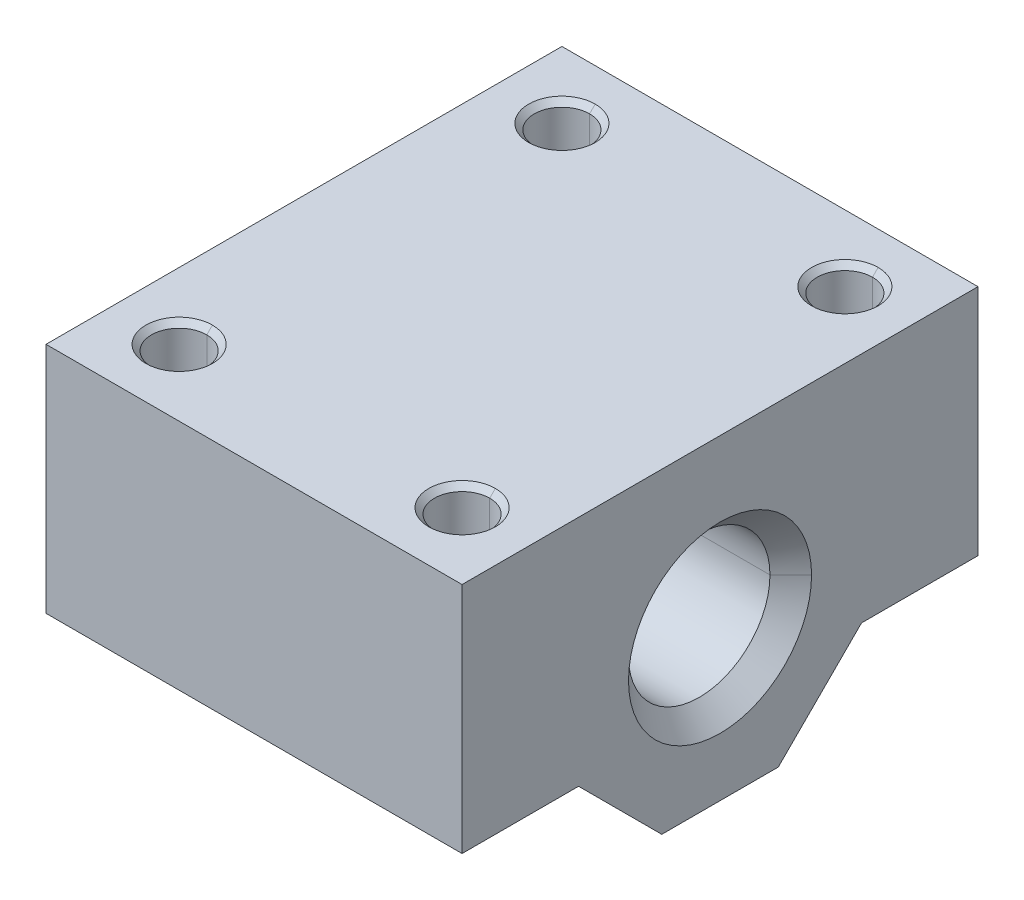
ISO-10303-21;
HEADER;
FILE_DESCRIPTION(('STEP AP214'),'2;1');
FILE_NAME('part.step','',(''),(''),'','','');
FILE_SCHEMA(('AUTOMOTIVE_DESIGN { 1 0 10303 214 1 1 1 1 }'));
ENDSEC;
DATA;
#1=APPLICATION_CONTEXT('core data for automotive mechanical design processes');
#2=APPLICATION_PROTOCOL_DEFINITION('international standard','automotive_design',2000,#1);
#3=PRODUCT_CONTEXT('',#1,'mechanical');
#4=PRODUCT('Part','Part','',(#3));
#5=PRODUCT_RELATED_PRODUCT_CATEGORY('part','',(#4));
#6=PRODUCT_DEFINITION_FORMATION('','',#4);
#7=PRODUCT_DEFINITION_CONTEXT('part definition',#1,'design');
#8=PRODUCT_DEFINITION('design','',#6,#7);
#9=PRODUCT_DEFINITION_SHAPE('','',#8);
#10=(LENGTH_UNIT() NAMED_UNIT(*) SI_UNIT(.MILLI.,.METRE.));
#11=(NAMED_UNIT(*) PLANE_ANGLE_UNIT() SI_UNIT($,.RADIAN.));
#12=(NAMED_UNIT(*) SI_UNIT($,.STERADIAN.) SOLID_ANGLE_UNIT());
#13=UNCERTAINTY_MEASURE_WITH_UNIT(LENGTH_MEASURE(1.E-05),#10,'distance_accuracy_value','');
#14=(GEOMETRIC_REPRESENTATION_CONTEXT(3) GLOBAL_UNCERTAINTY_ASSIGNED_CONTEXT((#13)) GLOBAL_UNIT_ASSIGNED_CONTEXT((#10,
#11,#12)) REPRESENTATION_CONTEXT('',''));
#15=CARTESIAN_POINT('',(0.,0.,0.));
#16=DIRECTION('',(0.,0.,1.));
#17=DIRECTION('',(1.,0.,0.));
#18=AXIS2_PLACEMENT_3D('',#15,#16,#17);
#19=CARTESIAN_POINT('',(50.,20.,31.));
#20=DIRECTION('',(0.,0.,-1.));
#21=DIRECTION('',(-1.,0.,0.));
#22=AXIS2_PLACEMENT_3D('',#19,#20,#21);
#23=PLANE('',#22);
#24=DIRECTION('',(0.,-1.,0.));
#25=VECTOR('',#24,1.);
#26=CARTESIAN_POINT('',(0.,20.,31.));
#27=LINE('',#26,#25);
#28=CARTESIAN_POINT('',(0.,20.,31.));
#29=VERTEX_POINT('',#28);
#30=CARTESIAN_POINT('',(0.,-8.,31.));
#31=VERTEX_POINT('',#30);
#32=EDGE_CURVE('E11',#29,#31,#27,.T.);
#33=ORIENTED_EDGE('',*,*,#32,.T.);
#34=DIRECTION('',(-1.,0.,0.));
#35=VECTOR('',#34,1.);
#36=CARTESIAN_POINT('',(50.,-8.,31.));
#37=LINE('',#36,#35);
#38=CARTESIAN_POINT('',(50.,-8.,31.));
#39=VERTEX_POINT('',#38);
#40=EDGE_CURVE('E25',#39,#31,#37,.T.);
#41=ORIENTED_EDGE('',*,*,#40,.F.);
#42=DIRECTION('',(0.,-1.,0.));
#43=VECTOR('',#42,1.);
#44=CARTESIAN_POINT('',(50.,20.,31.));
#45=LINE('',#44,#43);
#46=CARTESIAN_POINT('',(50.,20.,31.));
#47=VERTEX_POINT('',#46);
#48=EDGE_CURVE('E543',#47,#39,#45,.T.);
#49=ORIENTED_EDGE('',*,*,#48,.F.);
#50=DIRECTION('',(-1.,0.,0.));
#51=VECTOR('',#50,1.);
#52=CARTESIAN_POINT('',(50.,20.,31.));
#53=LINE('',#52,#51);
#54=EDGE_CURVE('E539',#47,#29,#53,.T.);
#55=ORIENTED_EDGE('',*,*,#54,.T.);
#56=EDGE_LOOP('',(#33,#41,#49,#55));
#57=FACE_BOUND('',#56,.T.);
#58=ADVANCED_FACE('F17',(#57),#23,.F.);
#59=CARTESIAN_POINT('',(50.,20.,-31.));
#60=DIRECTION('',(0.,-1.,0.));
#61=DIRECTION('',(0.,0.,-1.));
#62=AXIS2_PLACEMENT_3D('',#59,#60,#61);
#63=PLANE('',#62);
#64=CARTESIAN_POINT('',(8.,20.,-23.));
#65=DIRECTION('',(0.,-1.,0.));
#66=DIRECTION('',(0.,0.,-1.));
#67=AXIS2_PLACEMENT_3D('',#64,#65,#66);
#68=CIRCLE('',#67,4.);
#69=CARTESIAN_POINT('',(8.,20.,-27.));
#70=VERTEX_POINT('',#69);
#71=CARTESIAN_POINT('',(8.,20.,-19.));
#72=VERTEX_POINT('',#71);
#73=EDGE_CURVE('E203',#70,#72,#68,.T.);
#74=ORIENTED_EDGE('',*,*,#73,.T.);
#75=CARTESIAN_POINT('',(8.,20.,-23.));
#76=DIRECTION('',(0.,-1.,0.));
#77=DIRECTION('',(0.,0.,-1.));
#78=AXIS2_PLACEMENT_3D('',#75,#76,#77);
#79=CIRCLE('',#78,4.);
#80=EDGE_CURVE('E532',#72,#70,#79,.T.);
#81=ORIENTED_EDGE('',*,*,#80,.T.);
#82=EDGE_LOOP('',(#74,#81));
#83=FACE_BOUND('',#82,.T.);
#84=CARTESIAN_POINT('',(42.,20.,-23.));
#85=DIRECTION('',(0.,-1.,0.));
#86=DIRECTION('',(0.,0.,-1.));
#87=AXIS2_PLACEMENT_3D('',#84,#85,#86);
#88=CIRCLE('',#87,4.);
#89=CARTESIAN_POINT('',(42.,20.,-27.));
#90=VERTEX_POINT('',#89);
#91=CARTESIAN_POINT('',(42.,20.,-19.));
#92=VERTEX_POINT('',#91);
#93=EDGE_CURVE('E528',#90,#92,#88,.T.);
#94=ORIENTED_EDGE('',*,*,#93,.T.);
#95=CARTESIAN_POINT('',(42.,20.,-23.));
#96=DIRECTION('',(0.,-1.,0.));
#97=DIRECTION('',(0.,0.,-1.));
#98=AXIS2_PLACEMENT_3D('',#95,#96,#97);
#99=CIRCLE('',#98,4.);
#100=EDGE_CURVE('E524',#92,#90,#99,.T.);
#101=ORIENTED_EDGE('',*,*,#100,.T.);
#102=EDGE_LOOP('',(#94,#101));
#103=FACE_BOUND('',#102,.T.);
#104=CARTESIAN_POINT('',(42.,20.,23.));
#105=DIRECTION('',(0.,-1.,0.));
#106=DIRECTION('',(0.,0.,-1.));
#107=AXIS2_PLACEMENT_3D('',#104,#105,#106);
#108=CIRCLE('',#107,4.);
#109=CARTESIAN_POINT('',(42.,20.,19.));
#110=VERTEX_POINT('',#109);
#111=CARTESIAN_POINT('',(42.,20.,27.));
#112=VERTEX_POINT('',#111);
#113=EDGE_CURVE('E520',#110,#112,#108,.T.);
#114=ORIENTED_EDGE('',*,*,#113,.T.);
#115=CARTESIAN_POINT('',(42.,20.,23.));
#116=DIRECTION('',(0.,-1.,0.));
#117=DIRECTION('',(0.,0.,-1.));
#118=AXIS2_PLACEMENT_3D('',#115,#116,#117);
#119=CIRCLE('',#118,4.);
#120=EDGE_CURVE('E516',#112,#110,#119,.T.);
#121=ORIENTED_EDGE('',*,*,#120,.T.);
#122=EDGE_LOOP('',(#114,#121));
#123=FACE_BOUND('',#122,.T.);
#124=CARTESIAN_POINT('',(8.,20.,23.));
#125=DIRECTION('',(0.,-1.,0.));
#126=DIRECTION('',(0.,0.,-1.));
#127=AXIS2_PLACEMENT_3D('',#124,#125,#126);
#128=CIRCLE('',#127,4.);
#129=CARTESIAN_POINT('',(8.,20.,19.));
#130=VERTEX_POINT('',#129);
#131=CARTESIAN_POINT('',(8.,20.,27.));
#132=VERTEX_POINT('',#131);
#133=EDGE_CURVE('E512',#130,#132,#128,.T.);
#134=ORIENTED_EDGE('',*,*,#133,.T.);
#135=CARTESIAN_POINT('',(8.,20.,23.));
#136=DIRECTION('',(0.,-1.,0.));
#137=DIRECTION('',(0.,0.,-1.));
#138=AXIS2_PLACEMENT_3D('',#135,#136,#137);
#139=CIRCLE('',#138,4.);
#140=EDGE_CURVE('E508',#132,#130,#139,.T.);
#141=ORIENTED_EDGE('',*,*,#140,.T.);
#142=EDGE_LOOP('',(#134,#141));
#143=FACE_BOUND('',#142,.T.);
#144=DIRECTION('',(0.,0.,1.));
#145=VECTOR('',#144,1.);
#146=CARTESIAN_POINT('',(0.,20.,-31.));
#147=LINE('',#146,#145);
#148=CARTESIAN_POINT('',(0.,20.,-31.));
#149=VERTEX_POINT('',#148);
#150=EDGE_CURVE('E503',#149,#29,#147,.T.);
#151=ORIENTED_EDGE('',*,*,#150,.T.);
#152=ORIENTED_EDGE('',*,*,#54,.F.);
#153=DIRECTION('',(0.,0.,1.));
#154=VECTOR('',#153,1.);
#155=CARTESIAN_POINT('',(50.,20.,-31.));
#156=LINE('',#155,#154);
#157=CARTESIAN_POINT('',(50.,20.,-31.));
#158=VERTEX_POINT('',#157);
#159=EDGE_CURVE('E498',#158,#47,#156,.T.);
#160=ORIENTED_EDGE('',*,*,#159,.F.);
#161=DIRECTION('',(-1.,0.,0.));
#162=VECTOR('',#161,1.);
#163=CARTESIAN_POINT('',(50.,20.,-31.));
#164=LINE('',#163,#162);
#165=EDGE_CURVE('E494',#158,#149,#164,.T.);
#166=ORIENTED_EDGE('',*,*,#165,.T.);
#167=EDGE_LOOP('',(#151,#152,#160,#166));
#168=FACE_BOUND('',#167,.T.);
#169=ADVANCED_FACE('F561',(#83,#103,#123,#143,#168),#63,.F.);
#170=CARTESIAN_POINT('',(50.,-8.,-31.));
#171=DIRECTION('',(0.,0.,1.));
#172=DIRECTION('',(1.,0.,0.));
#173=AXIS2_PLACEMENT_3D('',#170,#171,#172);
#174=PLANE('',#173);
#175=DIRECTION('',(0.,1.,0.));
#176=VECTOR('',#175,1.);
#177=CARTESIAN_POINT('',(0.,-8.,-31.));
#178=LINE('',#177,#176);
#179=CARTESIAN_POINT('',(0.,-8.,-31.));
#180=VERTEX_POINT('',#179);
#181=EDGE_CURVE('E489',#180,#149,#178,.T.);
#182=ORIENTED_EDGE('',*,*,#181,.T.);
#183=ORIENTED_EDGE('',*,*,#165,.F.);
#184=DIRECTION('',(0.,1.,0.));
#185=VECTOR('',#184,1.);
#186=CARTESIAN_POINT('',(50.,-8.,-31.));
#187=LINE('',#186,#185);
#188=CARTESIAN_POINT('',(50.,-8.,-31.));
#189=VERTEX_POINT('',#188);
#190=EDGE_CURVE('E484',#189,#158,#187,.T.);
#191=ORIENTED_EDGE('',*,*,#190,.F.);
#192=DIRECTION('',(-1.,0.,0.));
#193=VECTOR('',#192,1.);
#194=CARTESIAN_POINT('',(50.,-8.,-31.));
#195=LINE('',#194,#193);
#196=EDGE_CURVE('E480',#189,#180,#195,.T.);
#197=ORIENTED_EDGE('',*,*,#196,.T.);
#198=EDGE_LOOP('',(#182,#183,#191,#197));
#199=FACE_BOUND('',#198,.T.);
#200=ADVANCED_FACE('F582',(#199),#174,.F.);
#201=CARTESIAN_POINT('',(50.,-8.,-17.));
#202=DIRECTION('',(0.,1.,0.));
#203=DIRECTION('',(0.,0.,1.));
#204=AXIS2_PLACEMENT_3D('',#201,#202,#203);
#205=PLANE('',#204);
#206=CARTESIAN_POINT('',(8.,-8.,-23.));
#207=DIRECTION('',(0.,-1.,0.));
#208=DIRECTION('',(0.,0.,-1.));
#209=AXIS2_PLACEMENT_3D('',#206,#207,#208);
#210=CIRCLE('',#209,3.3235);
#211=CARTESIAN_POINT('',(8.,-8.,-19.6765));
#212=VERTEX_POINT('',#211);
#213=CARTESIAN_POINT('',(8.,-8.,-26.3235));
#214=VERTEX_POINT('',#213);
#215=EDGE_CURVE('E192',#212,#214,#210,.T.);
#216=ORIENTED_EDGE('',*,*,#215,.F.);
#217=CARTESIAN_POINT('',(8.,-8.,-23.));
#218=DIRECTION('',(0.,-1.,0.));
#219=DIRECTION('',(0.,0.,-1.));
#220=AXIS2_PLACEMENT_3D('',#217,#218,#219);
#221=CIRCLE('',#220,3.3235);
#222=EDGE_CURVE('E473',#214,#212,#221,.T.);
#223=ORIENTED_EDGE('',*,*,#222,.F.);
#224=EDGE_LOOP('',(#216,#223));
#225=FACE_BOUND('',#224,.T.);
#226=CARTESIAN_POINT('',(42.,-8.,-23.));
#227=DIRECTION('',(0.,-1.,0.));
#228=DIRECTION('',(0.,0.,-1.));
#229=AXIS2_PLACEMENT_3D('',#226,#227,#228);
#230=CIRCLE('',#229,3.3235);
#231=CARTESIAN_POINT('',(42.,-8.,-19.6765));
#232=VERTEX_POINT('',#231);
#233=CARTESIAN_POINT('',(42.,-8.,-26.3235));
#234=VERTEX_POINT('',#233);
#235=EDGE_CURVE('E468',#232,#234,#230,.T.);
#236=ORIENTED_EDGE('',*,*,#235,.F.);
#237=CARTESIAN_POINT('',(42.,-8.,-23.));
#238=DIRECTION('',(0.,-1.,0.));
#239=DIRECTION('',(0.,0.,-1.));
#240=AXIS2_PLACEMENT_3D('',#237,#238,#239);
#241=CIRCLE('',#240,3.3235);
#242=EDGE_CURVE('E463',#234,#232,#241,.T.);
#243=ORIENTED_EDGE('',*,*,#242,.F.);
#244=EDGE_LOOP('',(#236,#243));
#245=FACE_BOUND('',#244,.T.);
#246=DIRECTION('',(0.,0.,-1.));
#247=VECTOR('',#246,1.);
#248=CARTESIAN_POINT('',(0.,-8.,-17.));
#249=LINE('',#248,#247);
#250=CARTESIAN_POINT('',(0.,-8.,-17.));
#251=VERTEX_POINT('',#250);
#252=EDGE_CURVE('E458',#251,#180,#249,.T.);
#253=ORIENTED_EDGE('',*,*,#252,.T.);
#254=ORIENTED_EDGE('',*,*,#196,.F.);
#255=DIRECTION('',(0.,0.,-1.));
#256=VECTOR('',#255,1.);
#257=CARTESIAN_POINT('',(50.,-8.,-17.));
#258=LINE('',#257,#256);
#259=CARTESIAN_POINT('',(50.,-8.,-17.));
#260=VERTEX_POINT('',#259);
#261=EDGE_CURVE('E453',#260,#189,#258,.T.);
#262=ORIENTED_EDGE('',*,*,#261,.F.);
#263=DIRECTION('',(-1.,0.,0.));
#264=VECTOR('',#263,1.);
#265=CARTESIAN_POINT('',(50.,-8.,-17.));
#266=LINE('',#265,#264);
#267=EDGE_CURVE('E449',#260,#251,#266,.T.);
#268=ORIENTED_EDGE('',*,*,#267,.T.);
#269=EDGE_LOOP('',(#253,#254,#262,#268));
#270=FACE_BOUND('',#269,.T.);
#271=ADVANCED_FACE('F579',(#225,#245,#270),#205,.F.);
#272=CARTESIAN_POINT('',(50.,-18.,-7.));
#273=DIRECTION('',(0.,0.707106781186548,0.707106781186548));
#274=DIRECTION('',(0.,-0.707106781186548,0.707106781186548));
#275=AXIS2_PLACEMENT_3D('',#272,#273,#274);
#276=PLANE('',#275);
#277=DIRECTION('',(0.,0.707106781186548,-0.707106781186548));
#278=VECTOR('',#277,1.);
#279=CARTESIAN_POINT('',(0.,-18.,-7.));
#280=LINE('',#279,#278);
#281=CARTESIAN_POINT('',(0.,-18.,-7.));
#282=VERTEX_POINT('',#281);
#283=EDGE_CURVE('E444',#282,#251,#280,.T.);
#284=ORIENTED_EDGE('',*,*,#283,.T.);
#285=ORIENTED_EDGE('',*,*,#267,.F.);
#286=DIRECTION('',(0.,0.707106781186548,-0.707106781186548));
#287=VECTOR('',#286,1.);
#288=CARTESIAN_POINT('',(50.,-18.,-7.));
#289=LINE('',#288,#287);
#290=CARTESIAN_POINT('',(50.,-18.,-7.));
#291=VERTEX_POINT('',#290);
#292=EDGE_CURVE('E439',#291,#260,#289,.T.);
#293=ORIENTED_EDGE('',*,*,#292,.F.);
#294=DIRECTION('',(-1.,0.,0.));
#295=VECTOR('',#294,1.);
#296=CARTESIAN_POINT('',(50.,-18.,-7.));
#297=LINE('',#296,#295);
#298=EDGE_CURVE('E435',#291,#282,#297,.T.);
#299=ORIENTED_EDGE('',*,*,#298,.T.);
#300=EDGE_LOOP('',(#284,#285,#293,#299));
#301=FACE_BOUND('',#300,.T.);
#302=ADVANCED_FACE('F576',(#301),#276,.F.);
#303=CARTESIAN_POINT('',(50.,-18.,7.));
#304=DIRECTION('',(0.,1.,0.));
#305=DIRECTION('',(0.,0.,1.));
#306=AXIS2_PLACEMENT_3D('',#303,#304,#305);
#307=PLANE('',#306);
#308=DIRECTION('',(0.,0.,-1.));
#309=VECTOR('',#308,1.);
#310=CARTESIAN_POINT('',(0.,-18.,7.));
#311=LINE('',#310,#309);
#312=CARTESIAN_POINT('',(0.,-18.,7.));
#313=VERTEX_POINT('',#312);
#314=EDGE_CURVE('E430',#313,#282,#311,.T.);
#315=ORIENTED_EDGE('',*,*,#314,.T.);
#316=ORIENTED_EDGE('',*,*,#298,.F.);
#317=DIRECTION('',(0.,0.,-1.));
#318=VECTOR('',#317,1.);
#319=CARTESIAN_POINT('',(50.,-18.,7.));
#320=LINE('',#319,#318);
#321=CARTESIAN_POINT('',(50.,-18.,7.));
#322=VERTEX_POINT('',#321);
#323=EDGE_CURVE('E425',#322,#291,#320,.T.);
#324=ORIENTED_EDGE('',*,*,#323,.F.);
#325=DIRECTION('',(-1.,0.,0.));
#326=VECTOR('',#325,1.);
#327=CARTESIAN_POINT('',(50.,-18.,7.));
#328=LINE('',#327,#326);
#329=EDGE_CURVE('E421',#322,#313,#328,.T.);
#330=ORIENTED_EDGE('',*,*,#329,.T.);
#331=EDGE_LOOP('',(#315,#316,#324,#330));
#332=FACE_BOUND('',#331,.T.);
#333=ADVANCED_FACE('F574',(#332),#307,.F.);
#334=CARTESIAN_POINT('',(50.,-8.,17.));
#335=DIRECTION('',(0.,0.707106781186548,-0.707106781186548));
#336=DIRECTION('',(0.,0.707106781186548,0.707106781186548));
#337=AXIS2_PLACEMENT_3D('',#334,#335,#336);
#338=PLANE('',#337);
#339=DIRECTION('',(0.,-0.707106781186548,-0.707106781186548));
#340=VECTOR('',#339,1.);
#341=CARTESIAN_POINT('',(0.,-8.,17.));
#342=LINE('',#341,#340);
#343=CARTESIAN_POINT('',(0.,-8.,17.));
#344=VERTEX_POINT('',#343);
#345=EDGE_CURVE('E416',#344,#313,#342,.T.);
#346=ORIENTED_EDGE('',*,*,#345,.T.);
#347=ORIENTED_EDGE('',*,*,#329,.F.);
#348=DIRECTION('',(0.,-0.707106781186548,-0.707106781186548));
#349=VECTOR('',#348,1.);
#350=CARTESIAN_POINT('',(50.,-8.,17.));
#351=LINE('',#350,#349);
#352=CARTESIAN_POINT('',(50.,-8.,17.));
#353=VERTEX_POINT('',#352);
#354=EDGE_CURVE('E411',#353,#322,#351,.T.);
#355=ORIENTED_EDGE('',*,*,#354,.F.);
#356=DIRECTION('',(-1.,0.,0.));
#357=VECTOR('',#356,1.);
#358=CARTESIAN_POINT('',(50.,-8.,17.));
#359=LINE('',#358,#357);
#360=EDGE_CURVE('E407',#353,#344,#359,.T.);
#361=ORIENTED_EDGE('',*,*,#360,.T.);
#362=EDGE_LOOP('',(#346,#347,#355,#361));
#363=FACE_BOUND('',#362,.T.);
#364=ADVANCED_FACE('F570',(#363),#338,.F.);
#365=CARTESIAN_POINT('',(50.,-8.,31.));
#366=DIRECTION('',(0.,1.,0.));
#367=DIRECTION('',(0.,0.,1.));
#368=AXIS2_PLACEMENT_3D('',#365,#366,#367);
#369=PLANE('',#368);
#370=CARTESIAN_POINT('',(42.,-8.,23.));
#371=DIRECTION('',(0.,-1.,0.));
#372=DIRECTION('',(0.,0.,-1.));
#373=AXIS2_PLACEMENT_3D('',#370,#371,#372);
#374=CIRCLE('',#373,3.3235);
#375=CARTESIAN_POINT('',(42.,-8.,26.3235));
#376=VERTEX_POINT('',#375);
#377=CARTESIAN_POINT('',(42.,-8.,19.6765));
#378=VERTEX_POINT('',#377);
#379=EDGE_CURVE('E402',#376,#378,#374,.T.);
#380=ORIENTED_EDGE('',*,*,#379,.F.);
#381=CARTESIAN_POINT('',(42.,-8.,23.));
#382=DIRECTION('',(0.,-1.,0.));
#383=DIRECTION('',(0.,0.,-1.));
#384=AXIS2_PLACEMENT_3D('',#381,#382,#383);
#385=CIRCLE('',#384,3.3235);
#386=EDGE_CURVE('E397',#378,#376,#385,.T.);
#387=ORIENTED_EDGE('',*,*,#386,.F.);
#388=EDGE_LOOP('',(#380,#387));
#389=FACE_BOUND('',#388,.T.);
#390=CARTESIAN_POINT('',(8.,-8.,23.));
#391=DIRECTION('',(0.,-1.,0.));
#392=DIRECTION('',(0.,0.,-1.));
#393=AXIS2_PLACEMENT_3D('',#390,#391,#392);
#394=CIRCLE('',#393,3.3235);
#395=CARTESIAN_POINT('',(8.,-8.,26.3235));
#396=VERTEX_POINT('',#395);
#397=CARTESIAN_POINT('',(8.,-8.,19.6765));
#398=VERTEX_POINT('',#397);
#399=EDGE_CURVE('E392',#396,#398,#394,.T.);
#400=ORIENTED_EDGE('',*,*,#399,.F.);
#401=CARTESIAN_POINT('',(8.,-8.,23.));
#402=DIRECTION('',(0.,-1.,0.));
#403=DIRECTION('',(0.,0.,-1.));
#404=AXIS2_PLACEMENT_3D('',#401,#402,#403);
#405=CIRCLE('',#404,3.3235);
#406=EDGE_CURVE('E387',#398,#396,#405,.T.);
#407=ORIENTED_EDGE('',*,*,#406,.F.);
#408=EDGE_LOOP('',(#400,#407));
#409=FACE_BOUND('',#408,.T.);
#410=DIRECTION('',(0.,0.,-1.));
#411=VECTOR('',#410,1.);
#412=CARTESIAN_POINT('',(0.,-8.,31.));
#413=LINE('',#412,#411);
#414=EDGE_CURVE('E382',#31,#344,#413,.T.);
#415=ORIENTED_EDGE('',*,*,#414,.T.);
#416=ORIENTED_EDGE('',*,*,#360,.F.);
#417=DIRECTION('',(0.,0.,-1.));
#418=VECTOR('',#417,1.);
#419=CARTESIAN_POINT('',(50.,-8.,31.));
#420=LINE('',#419,#418);
#421=EDGE_CURVE('E377',#39,#353,#420,.T.);
#422=ORIENTED_EDGE('',*,*,#421,.F.);
#423=ORIENTED_EDGE('',*,*,#40,.T.);
#424=EDGE_LOOP('',(#415,#416,#422,#423));
#425=FACE_BOUND('',#424,.T.);
#426=ADVANCED_FACE('F553',(#389,#409,#425),#369,.F.);
#427=CARTESIAN_POINT('',(50.,0.,0.));
#428=DIRECTION('',(1.,0.,0.));
#429=DIRECTION('',(0.,0.,-1.));
#430=AXIS2_PLACEMENT_3D('',#427,#428,#429);
#431=PLANE('',#430);
#432=CARTESIAN_POINT('',(50.,0.,0.));
#433=DIRECTION('',(1.,0.,0.));
#434=DIRECTION('',(0.,0.,-1.));
#435=AXIS2_PLACEMENT_3D('',#432,#433,#434);
#436=CIRCLE('',#435,11.);
#437=CARTESIAN_POINT('',(50.,0.,11.));
#438=VERTEX_POINT('',#437);
#439=CARTESIAN_POINT('',(50.,0.,-11.));
#440=VERTEX_POINT('',#439);
#441=EDGE_CURVE('E372',#438,#440,#436,.T.);
#442=ORIENTED_EDGE('',*,*,#441,.F.);
#443=CARTESIAN_POINT('',(50.,0.,0.));
#444=DIRECTION('',(1.,0.,0.));
#445=DIRECTION('',(0.,0.,-1.));
#446=AXIS2_PLACEMENT_3D('',#443,#444,#445);
#447=CIRCLE('',#446,11.);
#448=EDGE_CURVE('E367',#440,#438,#447,.T.);
#449=ORIENTED_EDGE('',*,*,#448,.F.);
#450=EDGE_LOOP('',(#442,#449));
#451=FACE_BOUND('',#450,.T.);
#452=ORIENTED_EDGE('',*,*,#48,.T.);
#453=ORIENTED_EDGE('',*,*,#421,.T.);
#454=ORIENTED_EDGE('',*,*,#354,.T.);
#455=ORIENTED_EDGE('',*,*,#323,.T.);
#456=ORIENTED_EDGE('',*,*,#292,.T.);
#457=ORIENTED_EDGE('',*,*,#261,.T.);
#458=ORIENTED_EDGE('',*,*,#190,.T.);
#459=ORIENTED_EDGE('',*,*,#159,.T.);
#460=EDGE_LOOP('',(#452,#453,#454,#455,#456,#457,#458,#459));
#461=FACE_BOUND('',#460,.T.);
#462=ADVANCED_FACE('F557',(#451,#461),#431,.T.);
#463=CARTESIAN_POINT('',(47.5,0.,0.));
#464=DIRECTION('',(1.,0.,0.));
#465=DIRECTION('',(0.,-1.,0.));
#466=AXIS2_PLACEMENT_3D('',#463,#464,#465);
#467=CONICAL_SURFACE('',#466,8.5,0.785398163397446);
#468=DIRECTION('',(0.707106781186549,0.,0.707106781186546));
#469=VECTOR('',#468,1.);
#470=CARTESIAN_POINT('',(47.5,0.,8.5));
#471=LINE('',#470,#469);
#472=CARTESIAN_POINT('',(47.5,0.,8.5));
#473=VERTEX_POINT('',#472);
#474=EDGE_CURVE('E362',#473,#438,#471,.T.);
#475=ORIENTED_EDGE('',*,*,#474,.F.);
#476=CARTESIAN_POINT('',(47.5,0.,0.));
#477=DIRECTION('',(1.,0.,0.));
#478=DIRECTION('',(0.,0.,-1.));
#479=AXIS2_PLACEMENT_3D('',#476,#477,#478);
#480=CIRCLE('',#479,8.5);
#481=CARTESIAN_POINT('',(47.5,0.,-8.5));
#482=VERTEX_POINT('',#481);
#483=EDGE_CURVE('E357',#482,#473,#480,.T.);
#484=ORIENTED_EDGE('',*,*,#483,.F.);
#485=DIRECTION('',(0.707106781186549,0.,-0.707106781186546));
#486=VECTOR('',#485,1.);
#487=CARTESIAN_POINT('',(47.5,0.,-8.5));
#488=LINE('',#487,#486);
#489=EDGE_CURVE('E352',#482,#440,#488,.T.);
#490=ORIENTED_EDGE('',*,*,#489,.T.);
#491=ORIENTED_EDGE('',*,*,#448,.T.);
#492=EDGE_LOOP('',(#475,#484,#490,#491));
#493=FACE_BOUND('',#492,.T.);
#494=ADVANCED_FACE('F664',(#493),#467,.F.);
#495=CARTESIAN_POINT('',(47.5,0.,0.));
#496=DIRECTION('',(1.,0.,0.));
#497=DIRECTION('',(0.,1.,0.));
#498=AXIS2_PLACEMENT_3D('',#495,#496,#497);
#499=CONICAL_SURFACE('',#498,8.5,0.785398163397446);
#500=ORIENTED_EDGE('',*,*,#474,.T.);
#501=ORIENTED_EDGE('',*,*,#441,.T.);
#502=ORIENTED_EDGE('',*,*,#489,.F.);
#503=CARTESIAN_POINT('',(47.5,0.,0.));
#504=DIRECTION('',(1.,0.,0.));
#505=DIRECTION('',(0.,0.,-1.));
#506=AXIS2_PLACEMENT_3D('',#503,#504,#505);
#507=CIRCLE('',#506,8.5);
#508=EDGE_CURVE('E347',#473,#482,#507,.T.);
#509=ORIENTED_EDGE('',*,*,#508,.F.);
#510=EDGE_LOOP('',(#500,#501,#502,#509));
#511=FACE_BOUND('',#510,.T.);
#512=ADVANCED_FACE('F675',(#511),#499,.F.);
#513=CARTESIAN_POINT('',(50.,0.,0.));
#514=DIRECTION('',(1.,0.,0.));
#515=DIRECTION('',(0.,1.,0.));
#516=AXIS2_PLACEMENT_3D('',#513,#514,#515);
#517=CYLINDRICAL_SURFACE('',#516,8.5);
#518=DIRECTION('',(1.,0.,0.));
#519=VECTOR('',#518,1.);
#520=CARTESIAN_POINT('',(2.5,0.,8.5));
#521=LINE('',#520,#519);
#522=CARTESIAN_POINT('',(2.5,0.,8.5));
#523=VERTEX_POINT('',#522);
#524=EDGE_CURVE('E342',#523,#473,#521,.T.);
#525=ORIENTED_EDGE('',*,*,#524,.T.);
#526=ORIENTED_EDGE('',*,*,#508,.T.);
#527=DIRECTION('',(1.,0.,0.));
#528=VECTOR('',#527,1.);
#529=CARTESIAN_POINT('',(2.5,0.,-8.5));
#530=LINE('',#529,#528);
#531=CARTESIAN_POINT('',(2.5,0.,-8.5));
#532=VERTEX_POINT('',#531);
#533=EDGE_CURVE('E337',#532,#482,#530,.T.);
#534=ORIENTED_EDGE('',*,*,#533,.F.);
#535=CARTESIAN_POINT('',(2.5,0.,0.));
#536=DIRECTION('',(1.,0.,0.));
#537=DIRECTION('',(0.,0.,-1.));
#538=AXIS2_PLACEMENT_3D('',#535,#536,#537);
#539=CIRCLE('',#538,8.5);
#540=EDGE_CURVE('E332',#523,#532,#539,.T.);
#541=ORIENTED_EDGE('',*,*,#540,.F.);
#542=EDGE_LOOP('',(#525,#526,#534,#541));
#543=FACE_BOUND('',#542,.T.);
#544=ADVANCED_FACE('F686',(#543),#517,.F.);
#545=CARTESIAN_POINT('',(0.,0.,0.));
#546=DIRECTION('',(-1.,0.,0.));
#547=DIRECTION('',(0.,1.,0.));
#548=AXIS2_PLACEMENT_3D('',#545,#546,#547);
#549=CONICAL_SURFACE('',#548,11.,0.785398163397448);
#550=DIRECTION('',(-0.707106781186548,0.,-0.707106781186547));
#551=VECTOR('',#550,1.);
#552=CARTESIAN_POINT('',(2.5,0.,-8.5));
#553=LINE('',#552,#551);
#554=CARTESIAN_POINT('',(0.,0.,-11.));
#555=VERTEX_POINT('',#554);
#556=EDGE_CURVE('E328',#532,#555,#553,.T.);
#557=ORIENTED_EDGE('',*,*,#556,.T.);
#558=CARTESIAN_POINT('',(0.,0.,0.));
#559=DIRECTION('',(1.,0.,0.));
#560=DIRECTION('',(0.,0.,-1.));
#561=AXIS2_PLACEMENT_3D('',#558,#559,#560);
#562=CIRCLE('',#561,11.);
#563=CARTESIAN_POINT('',(0.,0.,11.));
#564=VERTEX_POINT('',#563);
#565=EDGE_CURVE('E323',#564,#555,#562,.T.);
#566=ORIENTED_EDGE('',*,*,#565,.F.);
#567=DIRECTION('',(-0.707106781186548,0.,0.707106781186547));
#568=VECTOR('',#567,1.);
#569=CARTESIAN_POINT('',(2.5,0.,8.5));
#570=LINE('',#569,#568);
#571=EDGE_CURVE('E318',#523,#564,#570,.T.);
#572=ORIENTED_EDGE('',*,*,#571,.F.);
#573=ORIENTED_EDGE('',*,*,#540,.T.);
#574=EDGE_LOOP('',(#557,#566,#572,#573));
#575=FACE_BOUND('',#574,.T.);
#576=ADVANCED_FACE('F697',(#575),#549,.F.);
#577=CARTESIAN_POINT('',(0.,0.,0.));
#578=DIRECTION('',(-1.,0.,0.));
#579=DIRECTION('',(0.,-1.,0.));
#580=AXIS2_PLACEMENT_3D('',#577,#578,#579);
#581=CONICAL_SURFACE('',#580,11.,0.785398163397448);
#582=ORIENTED_EDGE('',*,*,#556,.F.);
#583=CARTESIAN_POINT('',(2.5,0.,0.));
#584=DIRECTION('',(1.,0.,0.));
#585=DIRECTION('',(0.,0.,-1.));
#586=AXIS2_PLACEMENT_3D('',#583,#584,#585);
#587=CIRCLE('',#586,8.5);
#588=EDGE_CURVE('E313',#532,#523,#587,.T.);
#589=ORIENTED_EDGE('',*,*,#588,.T.);
#590=ORIENTED_EDGE('',*,*,#571,.T.);
#591=CARTESIAN_POINT('',(0.,0.,0.));
#592=DIRECTION('',(1.,0.,0.));
#593=DIRECTION('',(0.,0.,-1.));
#594=AXIS2_PLACEMENT_3D('',#591,#592,#593);
#595=CIRCLE('',#594,11.);
#596=EDGE_CURVE('E308',#555,#564,#595,.T.);
#597=ORIENTED_EDGE('',*,*,#596,.F.);
#598=EDGE_LOOP('',(#582,#589,#590,#597));
#599=FACE_BOUND('',#598,.T.);
#600=ADVANCED_FACE('F708',(#599),#581,.F.);
#601=CARTESIAN_POINT('',(0.,0.,0.));
#602=DIRECTION('',(1.,0.,0.));
#603=DIRECTION('',(0.,0.,-1.));
#604=AXIS2_PLACEMENT_3D('',#601,#602,#603);
#605=PLANE('',#604);
#606=ORIENTED_EDGE('',*,*,#596,.T.);
#607=ORIENTED_EDGE('',*,*,#565,.T.);
#608=EDGE_LOOP('',(#606,#607));
#609=FACE_BOUND('',#608,.T.);
#610=ORIENTED_EDGE('',*,*,#32,.F.);
#611=ORIENTED_EDGE('',*,*,#150,.F.);
#612=ORIENTED_EDGE('',*,*,#181,.F.);
#613=ORIENTED_EDGE('',*,*,#252,.F.);
#614=ORIENTED_EDGE('',*,*,#283,.F.);
#615=ORIENTED_EDGE('',*,*,#314,.F.);
#616=ORIENTED_EDGE('',*,*,#345,.F.);
#617=ORIENTED_EDGE('',*,*,#414,.F.);
#618=EDGE_LOOP('',(#610,#611,#612,#613,#614,#615,#616,#617));
#619=FACE_BOUND('',#618,.T.);
#620=ADVANCED_FACE('F565',(#609,#619),#605,.F.);
#621=CARTESIAN_POINT('',(50.,0.,0.));
#622=DIRECTION('',(1.,0.,0.));
#623=DIRECTION('',(0.,-1.,0.));
#624=AXIS2_PLACEMENT_3D('',#621,#622,#623);
#625=CYLINDRICAL_SURFACE('',#624,8.5);
#626=ORIENTED_EDGE('',*,*,#524,.F.);
#627=ORIENTED_EDGE('',*,*,#588,.F.);
#628=ORIENTED_EDGE('',*,*,#533,.T.);
#629=ORIENTED_EDGE('',*,*,#483,.T.);
#630=EDGE_LOOP('',(#626,#627,#628,#629));
#631=FACE_BOUND('',#630,.T.);
#632=ADVANCED_FACE('F729',(#631),#625,.F.);
#633=CARTESIAN_POINT('',(8.,-8.,23.));
#634=DIRECTION('',(0.,-1.,0.));
#635=DIRECTION('',(-1.,0.,0.));
#636=AXIS2_PLACEMENT_3D('',#633,#634,#635);
#637=CYLINDRICAL_SURFACE('',#636,3.3235);
#638=DIRECTION('',(0.,-1.,0.));
#639=VECTOR('',#638,1.);
#640=CARTESIAN_POINT('',(8.,19.3235,26.3235));
#641=LINE('',#640,#639);
#642=CARTESIAN_POINT('',(8.,19.3235,26.3235));
#643=VERTEX_POINT('',#642);
#644=EDGE_CURVE('E303',#643,#396,#641,.T.);
#645=ORIENTED_EDGE('',*,*,#644,.F.);
#646=CARTESIAN_POINT('',(8.,19.3235,23.));
#647=DIRECTION('',(0.,-1.,0.));
#648=DIRECTION('',(0.,0.,-1.));
#649=AXIS2_PLACEMENT_3D('',#646,#647,#648);
#650=CIRCLE('',#649,3.3235);
#651=CARTESIAN_POINT('',(8.,19.3235,19.6765));
#652=VERTEX_POINT('',#651);
#653=EDGE_CURVE('E298',#652,#643,#650,.T.);
#654=ORIENTED_EDGE('',*,*,#653,.F.);
#655=DIRECTION('',(0.,-1.,0.));
#656=VECTOR('',#655,1.);
#657=CARTESIAN_POINT('',(8.,19.3235,19.6765));
#658=LINE('',#657,#656);
#659=EDGE_CURVE('E293',#652,#398,#658,.T.);
#660=ORIENTED_EDGE('',*,*,#659,.T.);
#661=ORIENTED_EDGE('',*,*,#406,.T.);
#662=EDGE_LOOP('',(#645,#654,#660,#661));
#663=FACE_BOUND('',#662,.T.);
#664=ADVANCED_FACE('F740',(#663),#637,.F.);
#665=CARTESIAN_POINT('',(8.,-8.,23.));
#666=DIRECTION('',(0.,-1.,0.));
#667=DIRECTION('',(1.,0.,0.));
#668=AXIS2_PLACEMENT_3D('',#665,#666,#667);
#669=CYLINDRICAL_SURFACE('',#668,3.3235);
#670=ORIENTED_EDGE('',*,*,#644,.T.);
#671=ORIENTED_EDGE('',*,*,#399,.T.);
#672=ORIENTED_EDGE('',*,*,#659,.F.);
#673=CARTESIAN_POINT('',(8.,19.3235,23.));
#674=DIRECTION('',(0.,-1.,0.));
#675=DIRECTION('',(0.,0.,-1.));
#676=AXIS2_PLACEMENT_3D('',#673,#674,#675);
#677=CIRCLE('',#676,3.3235);
#678=EDGE_CURVE('E288',#643,#652,#677,.T.);
#679=ORIENTED_EDGE('',*,*,#678,.F.);
#680=EDGE_LOOP('',(#670,#671,#672,#679));
#681=FACE_BOUND('',#680,.T.);
#682=ADVANCED_FACE('F751',(#681),#669,.F.);
#683=CARTESIAN_POINT('',(8.,20.,23.));
#684=DIRECTION('',(0.,1.,0.));
#685=DIRECTION('',(1.,0.,0.));
#686=AXIS2_PLACEMENT_3D('',#683,#684,#685);
#687=CONICAL_SURFACE('',#686,4.,0.785398163397448);
#688=DIRECTION('',(0.,0.707106781186548,-0.707106781186548));
#689=VECTOR('',#688,1.);
#690=CARTESIAN_POINT('',(8.,19.3235,19.6765));
#691=LINE('',#690,#689);
#692=EDGE_CURVE('E283',#652,#130,#691,.T.);
#693=ORIENTED_EDGE('',*,*,#692,.T.);
#694=ORIENTED_EDGE('',*,*,#140,.F.);
#695=DIRECTION('',(0.,0.707106781186548,0.707106781186548));
#696=VECTOR('',#695,1.);
#697=CARTESIAN_POINT('',(8.,19.3235,26.3235));
#698=LINE('',#697,#696);
#699=EDGE_CURVE('E278',#643,#132,#698,.T.);
#700=ORIENTED_EDGE('',*,*,#699,.F.);
#701=ORIENTED_EDGE('',*,*,#678,.T.);
#702=EDGE_LOOP('',(#693,#694,#700,#701));
#703=FACE_BOUND('',#702,.T.);
#704=ADVANCED_FACE('F762',(#703),#687,.F.);
#705=CARTESIAN_POINT('',(8.,20.,23.));
#706=DIRECTION('',(0.,1.,0.));
#707=DIRECTION('',(-1.,0.,0.));
#708=AXIS2_PLACEMENT_3D('',#705,#706,#707);
#709=CONICAL_SURFACE('',#708,4.,0.785398163397448);
#710=ORIENTED_EDGE('',*,*,#692,.F.);
#711=ORIENTED_EDGE('',*,*,#653,.T.);
#712=ORIENTED_EDGE('',*,*,#699,.T.);
#713=ORIENTED_EDGE('',*,*,#133,.F.);
#714=EDGE_LOOP('',(#710,#711,#712,#713));
#715=FACE_BOUND('',#714,.T.);
#716=ADVANCED_FACE('F773',(#715),#709,.F.);
#717=CARTESIAN_POINT('',(42.,-8.,23.));
#718=DIRECTION('',(0.,-1.,0.));
#719=DIRECTION('',(-1.,0.,0.));
#720=AXIS2_PLACEMENT_3D('',#717,#718,#719);
#721=CYLINDRICAL_SURFACE('',#720,3.3235);
#722=DIRECTION('',(0.,-1.,0.));
#723=VECTOR('',#722,1.);
#724=CARTESIAN_POINT('',(42.,19.3235,26.3235));
#725=LINE('',#724,#723);
#726=CARTESIAN_POINT('',(42.,19.3235,26.3235));
#727=VERTEX_POINT('',#726);
#728=EDGE_CURVE('E273',#727,#376,#725,.T.);
#729=ORIENTED_EDGE('',*,*,#728,.F.);
#730=CARTESIAN_POINT('',(42.,19.3235,23.));
#731=DIRECTION('',(0.,-1.,0.));
#732=DIRECTION('',(0.,0.,-1.));
#733=AXIS2_PLACEMENT_3D('',#730,#731,#732);
#734=CIRCLE('',#733,3.3235);
#735=CARTESIAN_POINT('',(42.,19.3235,19.6765));
#736=VERTEX_POINT('',#735);
#737=EDGE_CURVE('E268',#736,#727,#734,.T.);
#738=ORIENTED_EDGE('',*,*,#737,.F.);
#739=DIRECTION('',(0.,-1.,0.));
#740=VECTOR('',#739,1.);
#741=CARTESIAN_POINT('',(42.,19.3235,19.6765));
#742=LINE('',#741,#740);
#743=EDGE_CURVE('E263',#736,#378,#742,.T.);
#744=ORIENTED_EDGE('',*,*,#743,.T.);
#745=ORIENTED_EDGE('',*,*,#386,.T.);
#746=EDGE_LOOP('',(#729,#738,#744,#745));
#747=FACE_BOUND('',#746,.T.);
#748=ADVANCED_FACE('F784',(#747),#721,.F.);
#749=CARTESIAN_POINT('',(42.,-8.,23.));
#750=DIRECTION('',(0.,-1.,0.));
#751=DIRECTION('',(1.,0.,0.));
#752=AXIS2_PLACEMENT_3D('',#749,#750,#751);
#753=CYLINDRICAL_SURFACE('',#752,3.3235);
#754=ORIENTED_EDGE('',*,*,#728,.T.);
#755=ORIENTED_EDGE('',*,*,#379,.T.);
#756=ORIENTED_EDGE('',*,*,#743,.F.);
#757=CARTESIAN_POINT('',(42.,19.3235,23.));
#758=DIRECTION('',(0.,-1.,0.));
#759=DIRECTION('',(0.,0.,-1.));
#760=AXIS2_PLACEMENT_3D('',#757,#758,#759);
#761=CIRCLE('',#760,3.3235);
#762=EDGE_CURVE('E258',#727,#736,#761,.T.);
#763=ORIENTED_EDGE('',*,*,#762,.F.);
#764=EDGE_LOOP('',(#754,#755,#756,#763));
#765=FACE_BOUND('',#764,.T.);
#766=ADVANCED_FACE('F795',(#765),#753,.F.);
#767=CARTESIAN_POINT('',(42.,20.,23.));
#768=DIRECTION('',(0.,1.,0.));
#769=DIRECTION('',(1.,0.,0.));
#770=AXIS2_PLACEMENT_3D('',#767,#768,#769);
#771=CONICAL_SURFACE('',#770,4.,0.785398163397446);
#772=DIRECTION('',(0.,0.707106781186549,-0.707106781186546));
#773=VECTOR('',#772,1.);
#774=CARTESIAN_POINT('',(42.,19.3235,19.6765));
#775=LINE('',#774,#773);
#776=EDGE_CURVE('E253',#736,#110,#775,.T.);
#777=ORIENTED_EDGE('',*,*,#776,.T.);
#778=ORIENTED_EDGE('',*,*,#120,.F.);
#779=DIRECTION('',(0.,0.707106781186548,0.707106781186548));
#780=VECTOR('',#779,1.);
#781=CARTESIAN_POINT('',(42.,19.3235,26.3235));
#782=LINE('',#781,#780);
#783=EDGE_CURVE('E248',#727,#112,#782,.T.);
#784=ORIENTED_EDGE('',*,*,#783,.F.);
#785=ORIENTED_EDGE('',*,*,#762,.T.);
#786=EDGE_LOOP('',(#777,#778,#784,#785));
#787=FACE_BOUND('',#786,.T.);
#788=ADVANCED_FACE('F806',(#787),#771,.F.);
#789=CARTESIAN_POINT('',(42.,20.,23.));
#790=DIRECTION('',(0.,1.,0.));
#791=DIRECTION('',(-1.,0.,0.));
#792=AXIS2_PLACEMENT_3D('',#789,#790,#791);
#793=CONICAL_SURFACE('',#792,4.,0.785398163397446);
#794=ORIENTED_EDGE('',*,*,#776,.F.);
#795=ORIENTED_EDGE('',*,*,#737,.T.);
#796=ORIENTED_EDGE('',*,*,#783,.T.);
#797=ORIENTED_EDGE('',*,*,#113,.F.);
#798=EDGE_LOOP('',(#794,#795,#796,#797));
#799=FACE_BOUND('',#798,.T.);
#800=ADVANCED_FACE('F817',(#799),#793,.F.);
#801=CARTESIAN_POINT('',(42.,-8.,-23.));
#802=DIRECTION('',(0.,-1.,0.));
#803=DIRECTION('',(-1.,0.,0.));
#804=AXIS2_PLACEMENT_3D('',#801,#802,#803);
#805=CYLINDRICAL_SURFACE('',#804,3.3235);
#806=DIRECTION('',(0.,-1.,0.));
#807=VECTOR('',#806,1.);
#808=CARTESIAN_POINT('',(42.,19.3235,-19.6765));
#809=LINE('',#808,#807);
#810=CARTESIAN_POINT('',(42.,19.3235,-19.6765));
#811=VERTEX_POINT('',#810);
#812=EDGE_CURVE('E243',#811,#232,#809,.T.);
#813=ORIENTED_EDGE('',*,*,#812,.F.);
#814=CARTESIAN_POINT('',(42.,19.3235,-23.));
#815=DIRECTION('',(0.,-1.,0.));
#816=DIRECTION('',(0.,0.,-1.));
#817=AXIS2_PLACEMENT_3D('',#814,#815,#816);
#818=CIRCLE('',#817,3.3235);
#819=CARTESIAN_POINT('',(42.,19.3235,-26.3235));
#820=VERTEX_POINT('',#819);
#821=EDGE_CURVE('E238',#820,#811,#818,.T.);
#822=ORIENTED_EDGE('',*,*,#821,.F.);
#823=DIRECTION('',(0.,-1.,0.));
#824=VECTOR('',#823,1.);
#825=CARTESIAN_POINT('',(42.,19.3235,-26.3235));
#826=LINE('',#825,#824);
#827=EDGE_CURVE('E233',#820,#234,#826,.T.);
#828=ORIENTED_EDGE('',*,*,#827,.T.);
#829=ORIENTED_EDGE('',*,*,#242,.T.);
#830=EDGE_LOOP('',(#813,#822,#828,#829));
#831=FACE_BOUND('',#830,.T.);
#832=ADVANCED_FACE('F828',(#831),#805,.F.);
#833=CARTESIAN_POINT('',(42.,-8.,-23.));
#834=DIRECTION('',(0.,-1.,0.));
#835=DIRECTION('',(1.,0.,0.));
#836=AXIS2_PLACEMENT_3D('',#833,#834,#835);
#837=CYLINDRICAL_SURFACE('',#836,3.3235);
#838=ORIENTED_EDGE('',*,*,#812,.T.);
#839=ORIENTED_EDGE('',*,*,#235,.T.);
#840=ORIENTED_EDGE('',*,*,#827,.F.);
#841=CARTESIAN_POINT('',(42.,19.3235,-23.));
#842=DIRECTION('',(0.,-1.,0.));
#843=DIRECTION('',(0.,0.,-1.));
#844=AXIS2_PLACEMENT_3D('',#841,#842,#843);
#845=CIRCLE('',#844,3.3235);
#846=EDGE_CURVE('E228',#811,#820,#845,.T.);
#847=ORIENTED_EDGE('',*,*,#846,.F.);
#848=EDGE_LOOP('',(#838,#839,#840,#847));
#849=FACE_BOUND('',#848,.T.);
#850=ADVANCED_FACE('F839',(#849),#837,.F.);
#851=CARTESIAN_POINT('',(42.,20.,-23.));
#852=DIRECTION('',(0.,1.,0.));
#853=DIRECTION('',(1.,0.,0.));
#854=AXIS2_PLACEMENT_3D('',#851,#852,#853);
#855=CONICAL_SURFACE('',#854,4.,0.785398163397446);
#856=DIRECTION('',(0.,0.707106781186549,-0.707106781186546));
#857=VECTOR('',#856,1.);
#858=CARTESIAN_POINT('',(42.,19.3235,-26.3235));
#859=LINE('',#858,#857);
#860=EDGE_CURVE('E223',#820,#90,#859,.T.);
#861=ORIENTED_EDGE('',*,*,#860,.T.);
#862=ORIENTED_EDGE('',*,*,#100,.F.);
#863=DIRECTION('',(0.,0.707106781186548,0.707106781186548));
#864=VECTOR('',#863,1.);
#865=CARTESIAN_POINT('',(42.,19.3235,-19.6765));
#866=LINE('',#865,#864);
#867=EDGE_CURVE('E218',#811,#92,#866,.T.);
#868=ORIENTED_EDGE('',*,*,#867,.F.);
#869=ORIENTED_EDGE('',*,*,#846,.T.);
#870=EDGE_LOOP('',(#861,#862,#868,#869));
#871=FACE_BOUND('',#870,.T.);
#872=ADVANCED_FACE('F850',(#871),#855,.F.);
#873=CARTESIAN_POINT('',(42.,20.,-23.));
#874=DIRECTION('',(0.,1.,0.));
#875=DIRECTION('',(-1.,0.,0.));
#876=AXIS2_PLACEMENT_3D('',#873,#874,#875);
#877=CONICAL_SURFACE('',#876,4.,0.785398163397446);
#878=ORIENTED_EDGE('',*,*,#860,.F.);
#879=ORIENTED_EDGE('',*,*,#821,.T.);
#880=ORIENTED_EDGE('',*,*,#867,.T.);
#881=ORIENTED_EDGE('',*,*,#93,.F.);
#882=EDGE_LOOP('',(#878,#879,#880,#881));
#883=FACE_BOUND('',#882,.T.);
#884=ADVANCED_FACE('F861',(#883),#877,.F.);
#885=CARTESIAN_POINT('',(8.,-8.,-23.));
#886=DIRECTION('',(0.,-1.,0.));
#887=DIRECTION('',(-1.,0.,0.));
#888=AXIS2_PLACEMENT_3D('',#885,#886,#887);
#889=CYLINDRICAL_SURFACE('',#888,3.3235);
#890=DIRECTION('',(0.,-1.,0.));
#891=VECTOR('',#890,1.);
#892=CARTESIAN_POINT('',(8.,19.3235,-19.6765));
#893=LINE('',#892,#891);
#894=CARTESIAN_POINT('',(8.,19.3235,-19.6765));
#895=VERTEX_POINT('',#894);
#896=EDGE_CURVE('E181',#895,#212,#893,.T.);
#897=ORIENTED_EDGE('',*,*,#896,.F.);
#898=CARTESIAN_POINT('',(8.,19.3235,-23.));
#899=DIRECTION('',(0.,-1.,0.));
#900=DIRECTION('',(0.,0.,-1.));
#901=AXIS2_PLACEMENT_3D('',#898,#899,#900);
#902=CIRCLE('',#901,3.3235);
#903=CARTESIAN_POINT('',(8.,19.3235,-26.3235));
#904=VERTEX_POINT('',#903);
#905=EDGE_CURVE('E174',#904,#895,#902,.T.);
#906=ORIENTED_EDGE('',*,*,#905,.F.);
#907=DIRECTION('',(0.,-1.,0.));
#908=VECTOR('',#907,1.);
#909=CARTESIAN_POINT('',(8.,19.3235,-26.3235));
#910=LINE('',#909,#908);
#911=EDGE_CURVE('E178',#904,#214,#910,.T.);
#912=ORIENTED_EDGE('',*,*,#911,.T.);
#913=ORIENTED_EDGE('',*,*,#222,.T.);
#914=EDGE_LOOP('',(#897,#906,#912,#913));
#915=FACE_BOUND('',#914,.T.);
#916=ADVANCED_FACE('F176',(#915),#889,.F.);
#917=CARTESIAN_POINT('',(8.,-8.,-23.));
#918=DIRECTION('',(0.,-1.,0.));
#919=DIRECTION('',(1.,0.,0.));
#920=AXIS2_PLACEMENT_3D('',#917,#918,#919);
#921=CYLINDRICAL_SURFACE('',#920,3.3235);
#922=ORIENTED_EDGE('',*,*,#896,.T.);
#923=ORIENTED_EDGE('',*,*,#215,.T.);
#924=ORIENTED_EDGE('',*,*,#911,.F.);
#925=CARTESIAN_POINT('',(8.,19.3235,-23.));
#926=DIRECTION('',(0.,-1.,0.));
#927=DIRECTION('',(0.,0.,-1.));
#928=AXIS2_PLACEMENT_3D('',#925,#926,#927);
#929=CIRCLE('',#928,3.3235);
#930=EDGE_CURVE('E190',#895,#904,#929,.T.);
#931=ORIENTED_EDGE('',*,*,#930,.F.);
#932=EDGE_LOOP('',(#922,#923,#924,#931));
#933=FACE_BOUND('',#932,.T.);
#934=ADVANCED_FACE('F189',(#933),#921,.F.);
#935=CARTESIAN_POINT('',(8.,20.,-23.));
#936=DIRECTION('',(0.,1.,0.));
#937=DIRECTION('',(1.,0.,0.));
#938=AXIS2_PLACEMENT_3D('',#935,#936,#937);
#939=CONICAL_SURFACE('',#938,4.,0.785398163397448);
#940=DIRECTION('',(0.,0.707106781186548,-0.707106781186548));
#941=VECTOR('',#940,1.);
#942=CARTESIAN_POINT('',(8.,19.3235,-26.3235));
#943=LINE('',#942,#941);
#944=EDGE_CURVE('E198',#904,#70,#943,.T.);
#945=ORIENTED_EDGE('',*,*,#944,.T.);
#946=ORIENTED_EDGE('',*,*,#80,.F.);
#947=DIRECTION('',(0.,0.707106781186548,0.707106781186548));
#948=VECTOR('',#947,1.);
#949=CARTESIAN_POINT('',(8.,19.3235,-19.6765));
#950=LINE('',#949,#948);
#951=EDGE_CURVE('E200',#895,#72,#950,.T.);
#952=ORIENTED_EDGE('',*,*,#951,.F.);
#953=ORIENTED_EDGE('',*,*,#930,.T.);
#954=EDGE_LOOP('',(#945,#946,#952,#953));
#955=FACE_BOUND('',#954,.T.);
#956=ADVANCED_FACE('F196',(#955),#939,.F.);
#957=CARTESIAN_POINT('',(8.,20.,-23.));
#958=DIRECTION('',(0.,1.,0.));
#959=DIRECTION('',(-1.,0.,0.));
#960=AXIS2_PLACEMENT_3D('',#957,#958,#959);
#961=CONICAL_SURFACE('',#960,4.,0.785398163397448);
#962=ORIENTED_EDGE('',*,*,#944,.F.);
#963=ORIENTED_EDGE('',*,*,#905,.T.);
#964=ORIENTED_EDGE('',*,*,#951,.T.);
#965=ORIENTED_EDGE('',*,*,#73,.F.);
#966=EDGE_LOOP('',(#962,#963,#964,#965));
#967=FACE_BOUND('',#966,.T.);
#968=ADVANCED_FACE('F202',(#967),#961,.F.);
#969=CLOSED_SHELL('',(#58,#169,#200,#271,#302,#333,#364,#426,#462,#494,#512,#544,#576,#600,#620,
#632,#664,#682,#704,#716,#748,#766,#788,#800,#832,#850,#872,#884,#916,#934,#956,#968));
#970=MANIFOLD_SOLID_BREP('B1',#969);
#971=ADVANCED_BREP_SHAPE_REPRESENTATION('',(#18,#970),#14);
#972=SHAPE_DEFINITION_REPRESENTATION(#9,#971);
ENDSEC;
END-ISO-10303-21;
